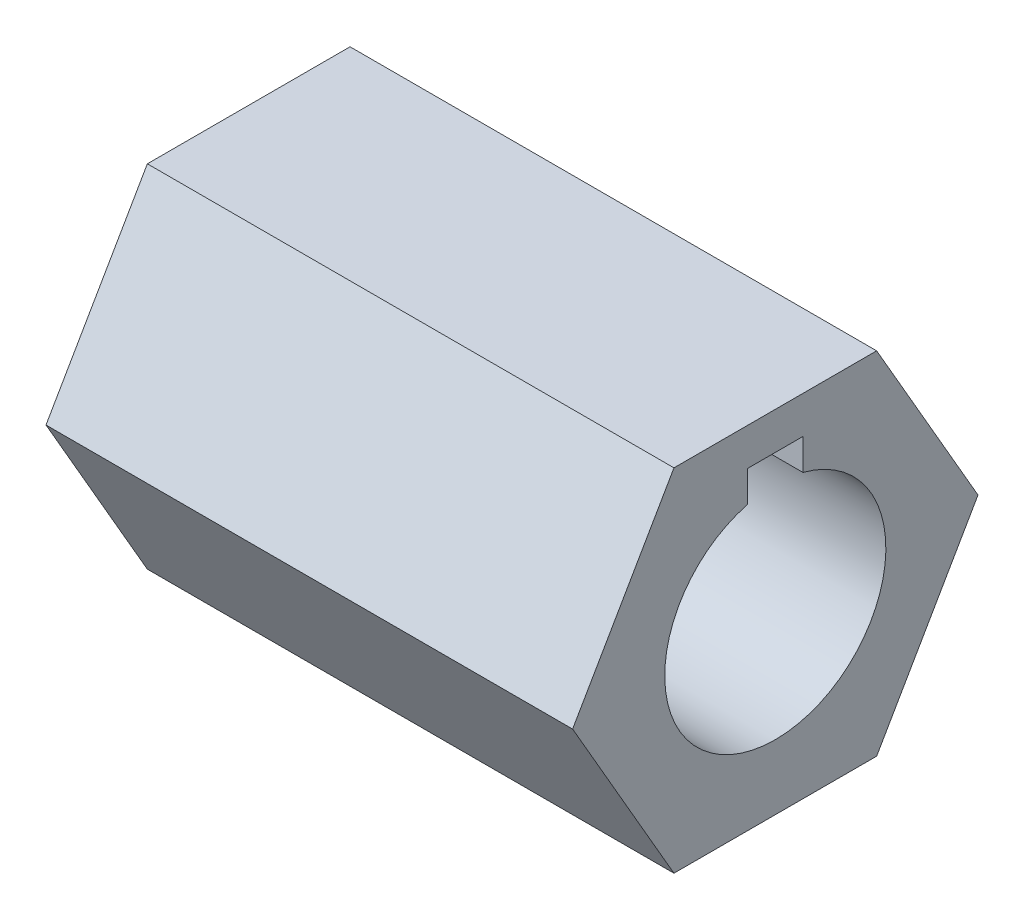
ISO-10303-21;
HEADER;
FILE_DESCRIPTION(('STEP AP214'),'2;1');
FILE_NAME('part.step','',(''),(''),'','','');
FILE_SCHEMA(('AUTOMOTIVE_DESIGN { 1 0 10303 214 1 1 1 1 }'));
ENDSEC;
DATA;
#1=APPLICATION_CONTEXT('core data for automotive mechanical design processes');
#2=APPLICATION_PROTOCOL_DEFINITION('international standard','automotive_design',2000,#1);
#3=PRODUCT_CONTEXT('',#1,'mechanical');
#4=PRODUCT('Part','Part','',(#3));
#5=PRODUCT_RELATED_PRODUCT_CATEGORY('part','',(#4));
#6=PRODUCT_DEFINITION_FORMATION('','',#4);
#7=PRODUCT_DEFINITION_CONTEXT('part definition',#1,'design');
#8=PRODUCT_DEFINITION('design','',#6,#7);
#9=PRODUCT_DEFINITION_SHAPE('','',#8);
#10=(LENGTH_UNIT() NAMED_UNIT(*) SI_UNIT(.MILLI.,.METRE.));
#11=(NAMED_UNIT(*) PLANE_ANGLE_UNIT() SI_UNIT($,.RADIAN.));
#12=(NAMED_UNIT(*) SI_UNIT($,.STERADIAN.) SOLID_ANGLE_UNIT());
#13=UNCERTAINTY_MEASURE_WITH_UNIT(LENGTH_MEASURE(1.E-05),#10,'distance_accuracy_value','');
#14=(GEOMETRIC_REPRESENTATION_CONTEXT(3) GLOBAL_UNCERTAINTY_ASSIGNED_CONTEXT((#13)) GLOBAL_UNIT_ASSIGNED_CONTEXT((#10,
#11,#12)) REPRESENTATION_CONTEXT('',''));
#15=CARTESIAN_POINT('',(0.,0.,0.));
#16=DIRECTION('',(0.,0.,1.));
#17=DIRECTION('',(1.,0.,0.));
#18=AXIS2_PLACEMENT_3D('',#15,#16,#17);
#19=CARTESIAN_POINT('',(19.05,-6.35,-3.66617420935412));
#20=DIRECTION('',(0.,0.499999999999999,0.866025403784439));
#21=DIRECTION('',(0.,-0.866025403784439,0.5));
#22=AXIS2_PLACEMENT_3D('',#19,#20,#21);
#23=PLANE('',#22);
#24=DIRECTION('',(0.,0.866025403784439,-0.5));
#25=VECTOR('',#24,1.);
#26=CARTESIAN_POINT('',(0.,-6.35,-3.66617420935412));
#27=LINE('',#26,#25);
#28=CARTESIAN_POINT('',(0.,-6.35,-3.66617420935412));
#29=VERTEX_POINT('',#28);
#30=CARTESIAN_POINT('',(0.,0.,-7.33234841870825));
#31=VERTEX_POINT('',#30);
#32=EDGE_CURVE('E141',#29,#31,#27,.T.);
#33=ORIENTED_EDGE('',*,*,#32,.T.);
#34=DIRECTION('',(-1.,0.,0.));
#35=VECTOR('',#34,1.);
#36=CARTESIAN_POINT('',(19.05,0.,-7.33234841870825));
#37=LINE('',#36,#35);
#38=CARTESIAN_POINT('',(19.05,0.,-7.33234841870825));
#39=VERTEX_POINT('',#38);
#40=EDGE_CURVE('E11',#39,#31,#37,.T.);
#41=ORIENTED_EDGE('',*,*,#40,.F.);
#42=DIRECTION('',(0.,0.866025403784439,-0.5));
#43=VECTOR('',#42,1.);
#44=CARTESIAN_POINT('',(19.05,-6.35,-3.66617420935412));
#45=LINE('',#44,#43);
#46=CARTESIAN_POINT('',(19.05,-6.35,-3.66617420935412));
#47=VERTEX_POINT('',#46);
#48=EDGE_CURVE('E145',#47,#39,#45,.T.);
#49=ORIENTED_EDGE('',*,*,#48,.F.);
#50=DIRECTION('',(-1.,0.,0.));
#51=VECTOR('',#50,1.);
#52=CARTESIAN_POINT('',(19.05,-6.35,-3.66617420935412));
#53=LINE('',#52,#51);
#54=EDGE_CURVE('E159',#47,#29,#53,.T.);
#55=ORIENTED_EDGE('',*,*,#54,.T.);
#56=EDGE_LOOP('',(#33,#41,#49,#55));
#57=FACE_BOUND('',#56,.T.);
#58=ADVANCED_FACE('F32',(#57),#23,.F.);
#59=CARTESIAN_POINT('',(19.05,0.,-7.33234841870825));
#60=DIRECTION('',(0.,-0.500000000000004,0.866025403784436));
#61=DIRECTION('',(0.,-0.866025403784436,-0.500000000000004));
#62=AXIS2_PLACEMENT_3D('',#59,#60,#61);
#63=PLANE('',#62);
#64=DIRECTION('',(0.,0.866025403784436,0.500000000000004));
#65=VECTOR('',#64,1.);
#66=CARTESIAN_POINT('',(0.,0.,-7.33234841870825));
#67=LINE('',#66,#65);
#68=CARTESIAN_POINT('',(0.,6.34999999999999,-3.6661742093541));
#69=VERTEX_POINT('',#68);
#70=EDGE_CURVE('E162',#31,#69,#67,.T.);
#71=ORIENTED_EDGE('',*,*,#70,.T.);
#72=DIRECTION('',(-1.,0.,0.));
#73=VECTOR('',#72,1.);
#74=CARTESIAN_POINT('',(19.05,6.34999999999999,-3.6661742093541));
#75=LINE('',#74,#73);
#76=CARTESIAN_POINT('',(19.05,6.34999999999999,-3.6661742093541));
#77=VERTEX_POINT('',#76);
#78=EDGE_CURVE('E39',#77,#69,#75,.T.);
#79=ORIENTED_EDGE('',*,*,#78,.F.);
#80=DIRECTION('',(0.,0.866025403784436,0.500000000000004));
#81=VECTOR('',#80,1.);
#82=CARTESIAN_POINT('',(19.05,0.,-7.33234841870825));
#83=LINE('',#82,#81);
#84=EDGE_CURVE('E148',#39,#77,#83,.T.);
#85=ORIENTED_EDGE('',*,*,#84,.F.);
#86=ORIENTED_EDGE('',*,*,#40,.T.);
#87=EDGE_LOOP('',(#71,#79,#85,#86));
#88=FACE_BOUND('',#87,.T.);
#89=ADVANCED_FACE('F207',(#88),#63,.F.);
#90=CARTESIAN_POINT('',(19.05,6.34999999999999,-3.6661742093541));
#91=DIRECTION('',(0.,-1.,0.));
#92=DIRECTION('',(0.,0.,-1.));
#93=AXIS2_PLACEMENT_3D('',#90,#91,#92);
#94=PLANE('',#93);
#95=DIRECTION('',(0.,0.,1.));
#96=VECTOR('',#95,1.);
#97=CARTESIAN_POINT('',(0.,6.34999999999999,-3.6661742093541));
#98=LINE('',#97,#96);
#99=CARTESIAN_POINT('',(0.,6.35,3.66617420935412));
#100=VERTEX_POINT('',#99);
#101=EDGE_CURVE('E164',#69,#100,#98,.T.);
#102=ORIENTED_EDGE('',*,*,#101,.T.);
#103=DIRECTION('',(-1.,0.,0.));
#104=VECTOR('',#103,1.);
#105=CARTESIAN_POINT('',(19.05,6.35,3.66617420935412));
#106=LINE('',#105,#104);
#107=CARTESIAN_POINT('',(19.05,6.35,3.66617420935412));
#108=VERTEX_POINT('',#107);
#109=EDGE_CURVE('E179',#108,#100,#106,.T.);
#110=ORIENTED_EDGE('',*,*,#109,.F.);
#111=DIRECTION('',(0.,0.,1.));
#112=VECTOR('',#111,1.);
#113=CARTESIAN_POINT('',(19.05,6.34999999999999,-3.6661742093541));
#114=LINE('',#113,#112);
#115=EDGE_CURVE('E151',#77,#108,#114,.T.);
#116=ORIENTED_EDGE('',*,*,#115,.F.);
#117=ORIENTED_EDGE('',*,*,#78,.T.);
#118=EDGE_LOOP('',(#102,#110,#116,#117));
#119=FACE_BOUND('',#118,.T.);
#120=ADVANCED_FACE('F186',(#119),#94,.F.);
#121=CARTESIAN_POINT('',(19.05,6.35,3.66617420935412));
#122=DIRECTION('',(0.,-0.5,-0.866025403784439));
#123=DIRECTION('',(0.,0.866025403784439,-0.5));
#124=AXIS2_PLACEMENT_3D('',#121,#122,#123);
#125=PLANE('',#124);
#126=DIRECTION('',(0.,-0.866025403784439,0.5));
#127=VECTOR('',#126,1.);
#128=CARTESIAN_POINT('',(0.,6.35,3.66617420935412));
#129=LINE('',#128,#127);
#130=CARTESIAN_POINT('',(0.,0.,7.33234841870825));
#131=VERTEX_POINT('',#130);
#132=EDGE_CURVE('E166',#100,#131,#129,.T.);
#133=ORIENTED_EDGE('',*,*,#132,.T.);
#134=DIRECTION('',(-1.,0.,0.));
#135=VECTOR('',#134,1.);
#136=CARTESIAN_POINT('',(19.05,0.,7.33234841870825));
#137=LINE('',#136,#135);
#138=CARTESIAN_POINT('',(19.05,0.,7.33234841870825));
#139=VERTEX_POINT('',#138);
#140=EDGE_CURVE('E176',#139,#131,#137,.T.);
#141=ORIENTED_EDGE('',*,*,#140,.F.);
#142=DIRECTION('',(0.,-0.866025403784439,0.5));
#143=VECTOR('',#142,1.);
#144=CARTESIAN_POINT('',(19.05,6.35,3.66617420935412));
#145=LINE('',#144,#143);
#146=EDGE_CURVE('E153',#108,#139,#145,.T.);
#147=ORIENTED_EDGE('',*,*,#146,.F.);
#148=ORIENTED_EDGE('',*,*,#109,.T.);
#149=EDGE_LOOP('',(#133,#141,#147,#148));
#150=FACE_BOUND('',#149,.T.);
#151=ADVANCED_FACE('F195',(#150),#125,.F.);
#152=CARTESIAN_POINT('',(19.05,0.,7.33234841870825));
#153=DIRECTION('',(0.,0.500000000000007,-0.866025403784435));
#154=DIRECTION('',(0.,0.866025403784435,0.500000000000007));
#155=AXIS2_PLACEMENT_3D('',#152,#153,#154);
#156=PLANE('',#155);
#157=DIRECTION('',(0.,-0.866025403784435,-0.500000000000007));
#158=VECTOR('',#157,1.);
#159=CARTESIAN_POINT('',(0.,0.,7.33234841870825));
#160=LINE('',#159,#158);
#161=CARTESIAN_POINT('',(0.,-6.35000000000001,3.66617420935405));
#162=VERTEX_POINT('',#161);
#163=EDGE_CURVE('E168',#131,#162,#160,.T.);
#164=ORIENTED_EDGE('',*,*,#163,.T.);
#165=DIRECTION('',(-1.,0.,0.));
#166=VECTOR('',#165,1.);
#167=CARTESIAN_POINT('',(19.05,-6.35000000000001,3.66617420935405));
#168=LINE('',#167,#166);
#169=CARTESIAN_POINT('',(19.05,-6.35000000000001,3.66617420935405));
#170=VERTEX_POINT('',#169);
#171=EDGE_CURVE('E173',#170,#162,#168,.T.);
#172=ORIENTED_EDGE('',*,*,#171,.F.);
#173=DIRECTION('',(0.,-0.866025403784435,-0.500000000000007));
#174=VECTOR('',#173,1.);
#175=CARTESIAN_POINT('',(19.05,0.,7.33234841870825));
#176=LINE('',#175,#174);
#177=EDGE_CURVE('E155',#139,#170,#176,.T.);
#178=ORIENTED_EDGE('',*,*,#177,.F.);
#179=ORIENTED_EDGE('',*,*,#140,.T.);
#180=EDGE_LOOP('',(#164,#172,#178,#179));
#181=FACE_BOUND('',#180,.T.);
#182=ADVANCED_FACE('F199',(#181),#156,.F.);
#183=CARTESIAN_POINT('',(19.05,-6.35000000000001,3.66617420935405));
#184=DIRECTION('',(0.,1.,0.));
#185=DIRECTION('',(0.,0.,1.));
#186=AXIS2_PLACEMENT_3D('',#183,#184,#185);
#187=PLANE('',#186);
#188=DIRECTION('',(0.,0.,-1.));
#189=VECTOR('',#188,1.);
#190=CARTESIAN_POINT('',(0.,-6.35000000000001,3.66617420935405));
#191=LINE('',#190,#189);
#192=EDGE_CURVE('E149',#162,#29,#191,.T.);
#193=ORIENTED_EDGE('',*,*,#192,.T.);
#194=ORIENTED_EDGE('',*,*,#54,.F.);
#195=DIRECTION('',(0.,0.,-1.));
#196=VECTOR('',#195,1.);
#197=CARTESIAN_POINT('',(19.05,-6.35000000000001,3.66617420935405));
#198=LINE('',#197,#196);
#199=EDGE_CURVE('E157',#170,#47,#198,.T.);
#200=ORIENTED_EDGE('',*,*,#199,.F.);
#201=ORIENTED_EDGE('',*,*,#171,.T.);
#202=EDGE_LOOP('',(#193,#194,#200,#201));
#203=FACE_BOUND('',#202,.T.);
#204=ADVANCED_FACE('F210',(#203),#187,.F.);
#205=CARTESIAN_POINT('',(19.05,0.,0.));
#206=DIRECTION('',(1.,0.,0.));
#207=DIRECTION('',(0.,0.,-1.));
#208=AXIS2_PLACEMENT_3D('',#205,#206,#207);
#209=PLANE('',#208);
#210=CARTESIAN_POINT('',(19.05,0.,0.));
#211=DIRECTION('',(1.,0.,0.));
#212=DIRECTION('',(0.,0.,-1.));
#213=AXIS2_PLACEMENT_3D('',#210,#211,#212);
#214=CIRCLE('',#213,4.);
#215=CARTESIAN_POINT('',(19.05,3.87298334620742,1.));
#216=VERTEX_POINT('',#215);
#217=CARTESIAN_POINT('',(19.05,3.87298334620742,-1.));
#218=VERTEX_POINT('',#217);
#219=EDGE_CURVE('E46',#216,#218,#214,.T.);
#220=ORIENTED_EDGE('',*,*,#219,.F.);
#221=DIRECTION('',(0.,1.,0.));
#222=VECTOR('',#221,1.);
#223=CARTESIAN_POINT('',(19.05,0.,1.));
#224=LINE('',#223,#222);
#225=CARTESIAN_POINT('',(19.05,5.,1.));
#226=VERTEX_POINT('',#225);
#227=EDGE_CURVE('E126',#216,#226,#224,.T.);
#228=ORIENTED_EDGE('',*,*,#227,.T.);
#229=DIRECTION('',(0.,0.,1.));
#230=VECTOR('',#229,1.);
#231=CARTESIAN_POINT('',(19.05,5.,0.));
#232=LINE('',#231,#230);
#233=CARTESIAN_POINT('',(19.05,5.,-1.));
#234=VERTEX_POINT('',#233);
#235=EDGE_CURVE('E129',#234,#226,#232,.T.);
#236=ORIENTED_EDGE('',*,*,#235,.F.);
#237=DIRECTION('',(0.,1.,0.));
#238=VECTOR('',#237,1.);
#239=CARTESIAN_POINT('',(19.05,0.,-1.));
#240=LINE('',#239,#238);
#241=EDGE_CURVE('E135',#218,#234,#240,.T.);
#242=ORIENTED_EDGE('',*,*,#241,.F.);
#243=EDGE_LOOP('',(#220,#228,#236,#242));
#244=FACE_BOUND('',#243,.T.);
#245=ORIENTED_EDGE('',*,*,#48,.T.);
#246=ORIENTED_EDGE('',*,*,#84,.T.);
#247=ORIENTED_EDGE('',*,*,#115,.T.);
#248=ORIENTED_EDGE('',*,*,#146,.T.);
#249=ORIENTED_EDGE('',*,*,#177,.T.);
#250=ORIENTED_EDGE('',*,*,#199,.T.);
#251=EDGE_LOOP('',(#245,#246,#247,#248,#249,#250));
#252=FACE_BOUND('',#251,.T.);
#253=ADVANCED_FACE('F203',(#244,#252),#209,.T.);
#254=CARTESIAN_POINT('',(0.,0.,0.));
#255=DIRECTION('',(1.,0.,0.));
#256=DIRECTION('',(0.,0.,-1.));
#257=AXIS2_PLACEMENT_3D('',#254,#255,#256);
#258=PLANE('',#257);
#259=DIRECTION('',(0.,1.,0.));
#260=VECTOR('',#259,1.);
#261=CARTESIAN_POINT('',(0.,0.,1.));
#262=LINE('',#261,#260);
#263=CARTESIAN_POINT('',(0.,3.87298334620742,1.));
#264=VERTEX_POINT('',#263);
#265=CARTESIAN_POINT('',(0.,5.,1.));
#266=VERTEX_POINT('',#265);
#267=EDGE_CURVE('E117',#264,#266,#262,.T.);
#268=ORIENTED_EDGE('',*,*,#267,.F.);
#269=CARTESIAN_POINT('',(0.,0.,0.));
#270=DIRECTION('',(1.,0.,0.));
#271=DIRECTION('',(0.,0.,-1.));
#272=AXIS2_PLACEMENT_3D('',#269,#270,#271);
#273=CIRCLE('',#272,4.);
#274=CARTESIAN_POINT('',(0.,3.87298334620742,-1.));
#275=VERTEX_POINT('',#274);
#276=EDGE_CURVE('E111',#264,#275,#273,.T.);
#277=ORIENTED_EDGE('',*,*,#276,.T.);
#278=DIRECTION('',(0.,1.,0.));
#279=VECTOR('',#278,1.);
#280=CARTESIAN_POINT('',(0.,0.,-1.));
#281=LINE('',#280,#279);
#282=CARTESIAN_POINT('',(0.,5.,-1.));
#283=VERTEX_POINT('',#282);
#284=EDGE_CURVE('E120',#275,#283,#281,.T.);
#285=ORIENTED_EDGE('',*,*,#284,.T.);
#286=DIRECTION('',(0.,0.,1.));
#287=VECTOR('',#286,1.);
#288=CARTESIAN_POINT('',(0.,5.,0.));
#289=LINE('',#288,#287);
#290=EDGE_CURVE('E54',#283,#266,#289,.T.);
#291=ORIENTED_EDGE('',*,*,#290,.T.);
#292=EDGE_LOOP('',(#268,#277,#285,#291));
#293=FACE_BOUND('',#292,.T.);
#294=ORIENTED_EDGE('',*,*,#32,.F.);
#295=ORIENTED_EDGE('',*,*,#192,.F.);
#296=ORIENTED_EDGE('',*,*,#163,.F.);
#297=ORIENTED_EDGE('',*,*,#132,.F.);
#298=ORIENTED_EDGE('',*,*,#101,.F.);
#299=ORIENTED_EDGE('',*,*,#70,.F.);
#300=EDGE_LOOP('',(#294,#295,#296,#297,#298,#299));
#301=FACE_BOUND('',#300,.T.);
#302=ADVANCED_FACE('F124',(#293,#301),#258,.F.);
#303=CARTESIAN_POINT('',(0.,0.,0.));
#304=DIRECTION('',(1.,0.,0.));
#305=DIRECTION('',(0.,0.,-1.));
#306=AXIS2_PLACEMENT_3D('',#303,#304,#305);
#307=CYLINDRICAL_SURFACE('',#306,4.);
#308=ORIENTED_EDGE('',*,*,#219,.T.);
#309=DIRECTION('',(1.,0.,0.));
#310=VECTOR('',#309,1.);
#311=CARTESIAN_POINT('',(0.,3.87298334620742,-1.));
#312=LINE('',#311,#310);
#313=EDGE_CURVE('E107',#275,#218,#312,.T.);
#314=ORIENTED_EDGE('',*,*,#313,.F.);
#315=ORIENTED_EDGE('',*,*,#276,.F.);
#316=DIRECTION('',(1.,0.,0.));
#317=VECTOR('',#316,1.);
#318=CARTESIAN_POINT('',(0.,3.87298334620742,1.));
#319=LINE('',#318,#317);
#320=EDGE_CURVE('E139',#264,#216,#319,.T.);
#321=ORIENTED_EDGE('',*,*,#320,.T.);
#322=EDGE_LOOP('',(#308,#314,#315,#321));
#323=FACE_BOUND('',#322,.T.);
#324=ADVANCED_FACE('F109',(#323),#307,.F.);
#325=CARTESIAN_POINT('',(0.,0.,1.));
#326=DIRECTION('',(0.,0.,-1.));
#327=DIRECTION('',(-1.,0.,0.));
#328=AXIS2_PLACEMENT_3D('',#325,#326,#327);
#329=PLANE('',#328);
#330=ORIENTED_EDGE('',*,*,#227,.F.);
#331=ORIENTED_EDGE('',*,*,#320,.F.);
#332=ORIENTED_EDGE('',*,*,#267,.T.);
#333=DIRECTION('',(1.,0.,0.));
#334=VECTOR('',#333,1.);
#335=CARTESIAN_POINT('',(0.,5.,1.));
#336=LINE('',#335,#334);
#337=EDGE_CURVE('E142',#266,#226,#336,.T.);
#338=ORIENTED_EDGE('',*,*,#337,.T.);
#339=EDGE_LOOP('',(#330,#331,#332,#338));
#340=FACE_BOUND('',#339,.T.);
#341=ADVANCED_FACE('F265',(#340),#329,.T.);
#342=CARTESIAN_POINT('',(0.,5.,0.));
#343=DIRECTION('',(0.,1.,0.));
#344=DIRECTION('',(0.,0.,1.));
#345=AXIS2_PLACEMENT_3D('',#342,#343,#344);
#346=PLANE('',#345);
#347=ORIENTED_EDGE('',*,*,#235,.T.);
#348=ORIENTED_EDGE('',*,*,#337,.F.);
#349=ORIENTED_EDGE('',*,*,#290,.F.);
#350=DIRECTION('',(1.,0.,0.));
#351=VECTOR('',#350,1.);
#352=CARTESIAN_POINT('',(0.,5.,-1.));
#353=LINE('',#352,#351);
#354=EDGE_CURVE('E116',#283,#234,#353,.T.);
#355=ORIENTED_EDGE('',*,*,#354,.T.);
#356=EDGE_LOOP('',(#347,#348,#349,#355));
#357=FACE_BOUND('',#356,.T.);
#358=ADVANCED_FACE('F274',(#357),#346,.F.);
#359=CARTESIAN_POINT('',(0.,0.,-1.));
#360=DIRECTION('',(0.,0.,-1.));
#361=DIRECTION('',(-1.,0.,0.));
#362=AXIS2_PLACEMENT_3D('',#359,#360,#361);
#363=PLANE('',#362);
#364=ORIENTED_EDGE('',*,*,#241,.T.);
#365=ORIENTED_EDGE('',*,*,#354,.F.);
#366=ORIENTED_EDGE('',*,*,#284,.F.);
#367=ORIENTED_EDGE('',*,*,#313,.T.);
#368=EDGE_LOOP('',(#364,#365,#366,#367));
#369=FACE_BOUND('',#368,.T.);
#370=ADVANCED_FACE('F121',(#369),#363,.F.);
#371=CLOSED_SHELL('',(#58,#89,#120,#151,#182,#204,#253,#302,#324,#341,#358,#370));
#372=MANIFOLD_SOLID_BREP('B2',#371);
#373=ADVANCED_BREP_SHAPE_REPRESENTATION('',(#18,#372),#14);
#374=SHAPE_DEFINITION_REPRESENTATION(#9,#373);
ENDSEC;
END-ISO-10303-21;
